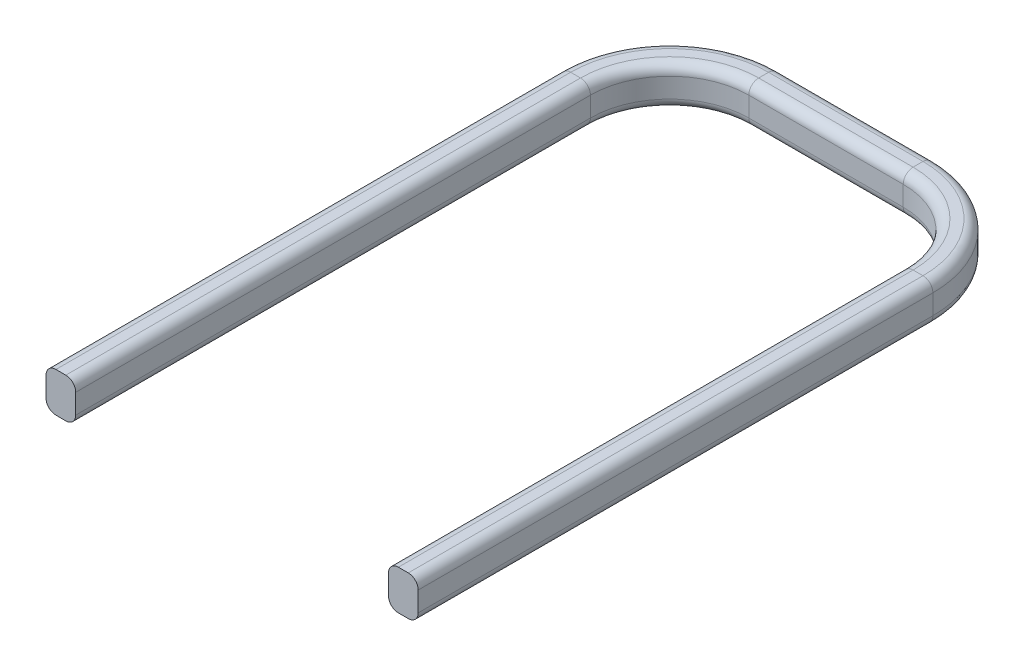
ISO-10303-21;
HEADER;
FILE_DESCRIPTION(('STEP AP214'),'2;1');
FILE_NAME('part.step','',(''),(''),'','','');
FILE_SCHEMA(('AUTOMOTIVE_DESIGN { 1 0 10303 214 1 1 1 1 }'));
ENDSEC;
DATA;
#1=APPLICATION_CONTEXT('core data for automotive mechanical design processes');
#2=APPLICATION_PROTOCOL_DEFINITION('international standard','automotive_design',2000,#1);
#3=PRODUCT_CONTEXT('',#1,'mechanical');
#4=PRODUCT('Part','Part','',(#3));
#5=PRODUCT_RELATED_PRODUCT_CATEGORY('part','',(#4));
#6=PRODUCT_DEFINITION_FORMATION('','',#4);
#7=PRODUCT_DEFINITION_CONTEXT('part definition',#1,'design');
#8=PRODUCT_DEFINITION('design','',#6,#7);
#9=PRODUCT_DEFINITION_SHAPE('','',#8);
#10=(LENGTH_UNIT() NAMED_UNIT(*) SI_UNIT(.MILLI.,.METRE.));
#11=(NAMED_UNIT(*) PLANE_ANGLE_UNIT() SI_UNIT($,.RADIAN.));
#12=(NAMED_UNIT(*) SI_UNIT($,.STERADIAN.) SOLID_ANGLE_UNIT());
#13=UNCERTAINTY_MEASURE_WITH_UNIT(LENGTH_MEASURE(1.E-05),#10,'distance_accuracy_value','');
#14=(GEOMETRIC_REPRESENTATION_CONTEXT(3) GLOBAL_UNCERTAINTY_ASSIGNED_CONTEXT((#13)) GLOBAL_UNIT_ASSIGNED_CONTEXT((#10,
#11,#12)) REPRESENTATION_CONTEXT('',''));
#15=CARTESIAN_POINT('',(0.,0.,0.));
#16=DIRECTION('',(0.,0.,1.));
#17=DIRECTION('',(1.,0.,0.));
#18=AXIS2_PLACEMENT_3D('',#15,#16,#17);
#19=CARTESIAN_POINT('',(7.9,0.,0.));
#20=DIRECTION('',(0.,0.,-1.));
#21=DIRECTION('',(-1.,0.,0.));
#22=AXIS2_PLACEMENT_3D('',#19,#20,#21);
#23=PLANE('',#22);
#24=DIRECTION('',(0.,1.,0.));
#25=VECTOR('',#24,1.);
#26=CARTESIAN_POINT('',(7.9,0.,0.));
#27=LINE('',#26,#25);
#28=CARTESIAN_POINT('',(7.9,0.25,0.));
#29=VERTEX_POINT('',#28);
#30=CARTESIAN_POINT('',(7.9,0.75,0.));
#31=VERTEX_POINT('',#30);
#32=EDGE_CURVE('E330',#29,#31,#27,.T.);
#33=ORIENTED_EDGE('',*,*,#32,.F.);
#34=CARTESIAN_POINT('',(8.15,0.25,0.));
#35=DIRECTION('',(0.,0.,-1.));
#36=DIRECTION('',(-1.,0.,0.));
#37=AXIS2_PLACEMENT_3D('',#34,#35,#36);
#38=CIRCLE('',#37,0.25);
#39=CARTESIAN_POINT('',(8.15,0.,0.));
#40=VERTEX_POINT('',#39);
#41=EDGE_CURVE('E220',#29,#40,#38,.F.);
#42=ORIENTED_EDGE('',*,*,#41,.T.);
#43=DIRECTION('',(-1.,0.,0.));
#44=VECTOR('',#43,1.);
#45=CARTESIAN_POINT('',(7.9,0.,0.));
#46=LINE('',#45,#44);
#47=CARTESIAN_POINT('',(8.4,0.,0.));
#48=VERTEX_POINT('',#47);
#49=EDGE_CURVE('E353',#48,#40,#46,.T.);
#50=ORIENTED_EDGE('',*,*,#49,.F.);
#51=CARTESIAN_POINT('',(8.4,0.25,0.));
#52=DIRECTION('',(0.,0.,-1.));
#53=DIRECTION('',(-1.,0.,0.));
#54=AXIS2_PLACEMENT_3D('',#51,#52,#53);
#55=CIRCLE('',#54,0.25);
#56=CARTESIAN_POINT('',(8.65,0.25,0.));
#57=VERTEX_POINT('',#56);
#58=EDGE_CURVE('E241',#48,#57,#55,.F.);
#59=ORIENTED_EDGE('',*,*,#58,.T.);
#60=DIRECTION('',(0.,-1.,0.));
#61=VECTOR('',#60,1.);
#62=CARTESIAN_POINT('',(8.65,0.,0.));
#63=LINE('',#62,#61);
#64=CARTESIAN_POINT('',(8.65,0.75,0.));
#65=VERTEX_POINT('',#64);
#66=EDGE_CURVE('E345',#65,#57,#63,.T.);
#67=ORIENTED_EDGE('',*,*,#66,.F.);
#68=CARTESIAN_POINT('',(8.4,0.75,0.));
#69=DIRECTION('',(0.,0.,-1.));
#70=DIRECTION('',(-1.,0.,0.));
#71=AXIS2_PLACEMENT_3D('',#68,#69,#70);
#72=CIRCLE('',#71,0.25);
#73=CARTESIAN_POINT('',(8.4,1.,0.));
#74=VERTEX_POINT('',#73);
#75=EDGE_CURVE('E429',#65,#74,#72,.F.);
#76=ORIENTED_EDGE('',*,*,#75,.T.);
#77=DIRECTION('',(1.,0.,0.));
#78=VECTOR('',#77,1.);
#79=CARTESIAN_POINT('',(7.9,1.,0.));
#80=LINE('',#79,#78);
#81=CARTESIAN_POINT('',(8.15,1.,0.));
#82=VERTEX_POINT('',#81);
#83=EDGE_CURVE('E337',#82,#74,#80,.T.);
#84=ORIENTED_EDGE('',*,*,#83,.F.);
#85=CARTESIAN_POINT('',(8.15,0.75,0.));
#86=DIRECTION('',(0.,0.,-1.));
#87=DIRECTION('',(-1.,0.,0.));
#88=AXIS2_PLACEMENT_3D('',#85,#86,#87);
#89=CIRCLE('',#88,0.25);
#90=EDGE_CURVE('E432',#82,#31,#89,.F.);
#91=ORIENTED_EDGE('',*,*,#90,.T.);
#92=EDGE_LOOP('',(#33,#42,#50,#59,#67,#76,#84,#91));
#93=FACE_BOUND('',#92,.T.);
#94=ADVANCED_FACE('F42',(#93),#23,.F.);
#95=CARTESIAN_POINT('',(0.,0.,0.));
#96=DIRECTION('',(0.,0.,1.));
#97=DIRECTION('',(1.,0.,0.));
#98=AXIS2_PLACEMENT_3D('',#95,#96,#97);
#99=PLANE('',#98);
#100=DIRECTION('',(1.,0.,0.));
#101=VECTOR('',#100,1.);
#102=CARTESIAN_POINT('',(0.,0.,0.));
#103=LINE('',#102,#101);
#104=CARTESIAN_POINT('',(-0.5,0.,0.));
#105=VERTEX_POINT('',#104);
#106=CARTESIAN_POINT('',(-0.25,0.,0.));
#107=VERTEX_POINT('',#106);
#108=EDGE_CURVE('E243',#105,#107,#103,.T.);
#109=ORIENTED_EDGE('',*,*,#108,.T.);
#110=CARTESIAN_POINT('',(-0.25,0.25,0.));
#111=DIRECTION('',(0.,0.,1.));
#112=DIRECTION('',(1.,0.,0.));
#113=AXIS2_PLACEMENT_3D('',#110,#111,#112);
#114=CIRCLE('',#113,0.25);
#115=CARTESIAN_POINT('',(0.,0.25,0.));
#116=VERTEX_POINT('',#115);
#117=EDGE_CURVE('E531',#107,#116,#114,.T.);
#118=ORIENTED_EDGE('',*,*,#117,.T.);
#119=DIRECTION('',(0.,1.,0.));
#120=VECTOR('',#119,1.);
#121=CARTESIAN_POINT('',(0.,0.,0.));
#122=LINE('',#121,#120);
#123=CARTESIAN_POINT('',(0.,0.75,0.));
#124=VERTEX_POINT('',#123);
#125=EDGE_CURVE('E369',#116,#124,#122,.T.);
#126=ORIENTED_EDGE('',*,*,#125,.T.);
#127=CARTESIAN_POINT('',(-0.25,0.75,0.));
#128=DIRECTION('',(0.,0.,1.));
#129=DIRECTION('',(1.,0.,0.));
#130=AXIS2_PLACEMENT_3D('',#127,#128,#129);
#131=CIRCLE('',#130,0.25);
#132=CARTESIAN_POINT('',(-0.25,1.,0.));
#133=VERTEX_POINT('',#132);
#134=EDGE_CURVE('E525',#124,#133,#131,.T.);
#135=ORIENTED_EDGE('',*,*,#134,.T.);
#136=DIRECTION('',(-1.,0.,0.));
#137=VECTOR('',#136,1.);
#138=CARTESIAN_POINT('',(0.,1.,0.));
#139=LINE('',#138,#137);
#140=CARTESIAN_POINT('',(-0.5,1.,0.));
#141=VERTEX_POINT('',#140);
#142=EDGE_CURVE('E372',#133,#141,#139,.T.);
#143=ORIENTED_EDGE('',*,*,#142,.T.);
#144=CARTESIAN_POINT('',(-0.5,0.75,0.));
#145=DIRECTION('',(0.,0.,1.));
#146=DIRECTION('',(1.,0.,0.));
#147=AXIS2_PLACEMENT_3D('',#144,#145,#146);
#148=CIRCLE('',#147,0.25);
#149=CARTESIAN_POINT('',(-0.75,0.75,0.));
#150=VERTEX_POINT('',#149);
#151=EDGE_CURVE('E67',#141,#150,#148,.T.);
#152=ORIENTED_EDGE('',*,*,#151,.T.);
#153=DIRECTION('',(0.,-1.,0.));
#154=VECTOR('',#153,1.);
#155=CARTESIAN_POINT('',(-0.75,0.,0.));
#156=LINE('',#155,#154);
#157=CARTESIAN_POINT('',(-0.75,0.25,0.));
#158=VERTEX_POINT('',#157);
#159=EDGE_CURVE('E391',#150,#158,#156,.T.);
#160=ORIENTED_EDGE('',*,*,#159,.T.);
#161=CARTESIAN_POINT('',(-0.5,0.25,0.));
#162=DIRECTION('',(0.,0.,1.));
#163=DIRECTION('',(1.,0.,0.));
#164=AXIS2_PLACEMENT_3D('',#161,#162,#163);
#165=CIRCLE('',#164,0.25);
#166=EDGE_CURVE('E528',#158,#105,#165,.T.);
#167=ORIENTED_EDGE('',*,*,#166,.T.);
#168=EDGE_LOOP('',(#109,#118,#126,#135,#143,#152,#160,#167));
#169=FACE_BOUND('',#168,.T.);
#170=ADVANCED_FACE('F623',(#169),#99,.T.);
#171=CARTESIAN_POINT('',(7.9,0.,0.));
#172=DIRECTION('',(-1.,0.,0.));
#173=DIRECTION('',(0.,0.,1.));
#174=AXIS2_PLACEMENT_3D('',#171,#172,#173);
#175=PLANE('',#174);
#176=DIRECTION('',(0.,1.,0.));
#177=VECTOR('',#176,1.);
#178=CARTESIAN_POINT('',(7.9,0.,-13.));
#179=LINE('',#178,#177);
#180=CARTESIAN_POINT('',(7.9,0.25,-13.));
#181=VERTEX_POINT('',#180);
#182=CARTESIAN_POINT('',(7.9,0.75,-13.));
#183=VERTEX_POINT('',#182);
#184=EDGE_CURVE('E348',#181,#183,#179,.T.);
#185=ORIENTED_EDGE('',*,*,#184,.F.);
#186=DIRECTION('',(0.,0.,-1.));
#187=VECTOR('',#186,1.);
#188=CARTESIAN_POINT('',(7.9,0.25,0.));
#189=LINE('',#188,#187);
#190=EDGE_CURVE('E426',#181,#29,#189,.F.);
#191=ORIENTED_EDGE('',*,*,#190,.T.);
#192=ORIENTED_EDGE('',*,*,#32,.T.);
#193=DIRECTION('',(0.,0.,-1.));
#194=VECTOR('',#193,1.);
#195=CARTESIAN_POINT('',(7.9,0.75,0.));
#196=LINE('',#195,#194);
#197=EDGE_CURVE('E423',#31,#183,#196,.T.);
#198=ORIENTED_EDGE('',*,*,#197,.T.);
#199=EDGE_LOOP('',(#185,#191,#192,#198));
#200=FACE_BOUND('',#199,.T.);
#201=ADVANCED_FACE('F579',(#200),#175,.T.);
#202=CARTESIAN_POINT('',(7.9,1.,0.));
#203=DIRECTION('',(0.,1.,0.));
#204=DIRECTION('',(0.,0.,1.));
#205=AXIS2_PLACEMENT_3D('',#202,#203,#204);
#206=PLANE('',#205);
#207=DIRECTION('',(1.,0.,0.));
#208=VECTOR('',#207,1.);
#209=CARTESIAN_POINT('',(7.9,1.,-13.));
#210=LINE('',#209,#208);
#211=CARTESIAN_POINT('',(8.15,1.,-13.));
#212=VERTEX_POINT('',#211);
#213=CARTESIAN_POINT('',(8.4,1.,-13.));
#214=VERTEX_POINT('',#213);
#215=EDGE_CURVE('E352',#212,#214,#210,.T.);
#216=ORIENTED_EDGE('',*,*,#215,.F.);
#217=DIRECTION('',(0.,0.,-1.));
#218=VECTOR('',#217,1.);
#219=CARTESIAN_POINT('',(8.15,1.,0.));
#220=LINE('',#219,#218);
#221=EDGE_CURVE('E497',#212,#82,#220,.F.);
#222=ORIENTED_EDGE('',*,*,#221,.T.);
#223=ORIENTED_EDGE('',*,*,#83,.T.);
#224=DIRECTION('',(0.,0.,-1.));
#225=VECTOR('',#224,1.);
#226=CARTESIAN_POINT('',(8.4,1.,0.));
#227=LINE('',#226,#225);
#228=EDGE_CURVE('E493',#74,#214,#227,.T.);
#229=ORIENTED_EDGE('',*,*,#228,.T.);
#230=EDGE_LOOP('',(#216,#222,#223,#229));
#231=FACE_BOUND('',#230,.T.);
#232=ADVANCED_FACE('F588',(#231),#206,.T.);
#233=CARTESIAN_POINT('',(8.65,0.,0.));
#234=DIRECTION('',(1.,0.,0.));
#235=DIRECTION('',(0.,1.,0.));
#236=AXIS2_PLACEMENT_3D('',#233,#234,#235);
#237=PLANE('',#236);
#238=ORIENTED_EDGE('',*,*,#66,.T.);
#239=DIRECTION('',(0.,0.,-1.));
#240=VECTOR('',#239,1.);
#241=CARTESIAN_POINT('',(8.65,0.25,0.));
#242=LINE('',#241,#240);
#243=CARTESIAN_POINT('',(8.65,0.25,-13.));
#244=VERTEX_POINT('',#243);
#245=EDGE_CURVE('E474',#57,#244,#242,.T.);
#246=ORIENTED_EDGE('',*,*,#245,.T.);
#247=DIRECTION('',(0.,-1.,0.));
#248=VECTOR('',#247,1.);
#249=CARTESIAN_POINT('',(8.65,0.,-13.));
#250=LINE('',#249,#248);
#251=CARTESIAN_POINT('',(8.65,0.75,-13.));
#252=VERTEX_POINT('',#251);
#253=EDGE_CURVE('E233',#252,#244,#250,.T.);
#254=ORIENTED_EDGE('',*,*,#253,.F.);
#255=DIRECTION('',(0.,0.,-1.));
#256=VECTOR('',#255,1.);
#257=CARTESIAN_POINT('',(8.65,0.75,0.));
#258=LINE('',#257,#256);
#259=EDGE_CURVE('E471',#252,#65,#258,.F.);
#260=ORIENTED_EDGE('',*,*,#259,.T.);
#261=EDGE_LOOP('',(#238,#246,#254,#260));
#262=FACE_BOUND('',#261,.T.);
#263=ADVANCED_FACE('F999',(#262),#237,.T.);
#264=CARTESIAN_POINT('',(7.9,0.,0.));
#265=DIRECTION('',(0.,-1.,0.));
#266=DIRECTION('',(1.,0.,0.));
#267=AXIS2_PLACEMENT_3D('',#264,#265,#266);
#268=PLANE('',#267);
#269=ORIENTED_EDGE('',*,*,#49,.T.);
#270=DIRECTION('',(0.,0.,-1.));
#271=VECTOR('',#270,1.);
#272=CARTESIAN_POINT('',(8.15,0.,0.));
#273=LINE('',#272,#271);
#274=CARTESIAN_POINT('',(8.15,0.,-13.));
#275=VERTEX_POINT('',#274);
#276=EDGE_CURVE('E230',#40,#275,#273,.T.);
#277=ORIENTED_EDGE('',*,*,#276,.T.);
#278=DIRECTION('',(-1.,0.,0.));
#279=VECTOR('',#278,1.);
#280=CARTESIAN_POINT('',(7.9,0.,-13.));
#281=LINE('',#280,#279);
#282=CARTESIAN_POINT('',(8.4,0.,-13.));
#283=VERTEX_POINT('',#282);
#284=EDGE_CURVE('E211',#283,#275,#281,.T.);
#285=ORIENTED_EDGE('',*,*,#284,.F.);
#286=DIRECTION('',(0.,0.,-1.));
#287=VECTOR('',#286,1.);
#288=CARTESIAN_POINT('',(8.4,0.,0.));
#289=LINE('',#288,#287);
#290=EDGE_CURVE('E227',#283,#48,#289,.F.);
#291=ORIENTED_EDGE('',*,*,#290,.T.);
#292=EDGE_LOOP('',(#269,#277,#285,#291));
#293=FACE_BOUND('',#292,.T.);
#294=ADVANCED_FACE('F226',(#293),#268,.T.);
#295=CARTESIAN_POINT('',(5.9,0.,-13.));
#296=DIRECTION('',(0.,1.,0.));
#297=DIRECTION('',(0.,0.,1.));
#298=AXIS2_PLACEMENT_3D('',#295,#296,#297);
#299=CYLINDRICAL_SURFACE('',#298,2.);
#300=DIRECTION('',(0.,1.,0.));
#301=VECTOR('',#300,1.);
#302=CARTESIAN_POINT('',(5.9,0.,-15.));
#303=LINE('',#302,#301);
#304=CARTESIAN_POINT('',(5.9,0.25,-15.));
#305=VERTEX_POINT('',#304);
#306=CARTESIAN_POINT('',(5.9,0.75,-15.));
#307=VERTEX_POINT('',#306);
#308=EDGE_CURVE('E232',#305,#307,#303,.T.);
#309=ORIENTED_EDGE('',*,*,#308,.F.);
#310=CARTESIAN_POINT('',(5.9,0.25,-13.));
#311=DIRECTION('',(0.,-1.,0.));
#312=DIRECTION('',(0.,0.,-1.));
#313=AXIS2_PLACEMENT_3D('',#310,#311,#312);
#314=CIRCLE('',#313,2.);
#315=EDGE_CURVE('E444',#305,#181,#314,.T.);
#316=ORIENTED_EDGE('',*,*,#315,.T.);
#317=ORIENTED_EDGE('',*,*,#184,.T.);
#318=CARTESIAN_POINT('',(5.9,0.75,-13.));
#319=DIRECTION('',(0.,1.,0.));
#320=DIRECTION('',(0.,0.,1.));
#321=AXIS2_PLACEMENT_3D('',#318,#319,#320);
#322=CIRCLE('',#321,2.);
#323=EDGE_CURVE('E441',#183,#307,#322,.T.);
#324=ORIENTED_EDGE('',*,*,#323,.T.);
#325=EDGE_LOOP('',(#309,#316,#317,#324));
#326=FACE_BOUND('',#325,.T.);
#327=ADVANCED_FACE('F571',(#326),#299,.F.);
#328=CARTESIAN_POINT('',(7.9,1.,-13.));
#329=DIRECTION('',(0.,1.,0.));
#330=DIRECTION('',(0.,0.,1.));
#331=AXIS2_PLACEMENT_3D('',#328,#329,#330);
#332=PLANE('',#331);
#333=DIRECTION('',(0.,0.,-1.));
#334=VECTOR('',#333,1.);
#335=CARTESIAN_POINT('',(5.9,1.,-15.));
#336=LINE('',#335,#334);
#337=CARTESIAN_POINT('',(5.9,1.,-15.25));
#338=VERTEX_POINT('',#337);
#339=CARTESIAN_POINT('',(5.9,1.,-15.5));
#340=VERTEX_POINT('',#339);
#341=EDGE_CURVE('E357',#338,#340,#336,.T.);
#342=ORIENTED_EDGE('',*,*,#341,.F.);
#343=CARTESIAN_POINT('',(5.9,1.,-13.));
#344=DIRECTION('',(0.,1.,0.));
#345=DIRECTION('',(0.,0.,1.));
#346=AXIS2_PLACEMENT_3D('',#343,#344,#345);
#347=CIRCLE('',#346,2.25);
#348=EDGE_CURVE('E503',#338,#212,#347,.F.);
#349=ORIENTED_EDGE('',*,*,#348,.T.);
#350=ORIENTED_EDGE('',*,*,#215,.T.);
#351=CARTESIAN_POINT('',(5.9,1.,-13.));
#352=DIRECTION('',(0.,1.,0.));
#353=DIRECTION('',(0.,0.,1.));
#354=AXIS2_PLACEMENT_3D('',#351,#352,#353);
#355=CIRCLE('',#354,2.5);
#356=EDGE_CURVE('E500',#214,#340,#355,.T.);
#357=ORIENTED_EDGE('',*,*,#356,.T.);
#358=EDGE_LOOP('',(#342,#349,#350,#357));
#359=FACE_BOUND('',#358,.T.);
#360=ADVANCED_FACE('F600',(#359),#332,.T.);
#361=CARTESIAN_POINT('',(5.9,0.,-13.));
#362=DIRECTION('',(0.,1.,0.));
#363=DIRECTION('',(0.,0.,1.));
#364=AXIS2_PLACEMENT_3D('',#361,#362,#363);
#365=CYLINDRICAL_SURFACE('',#364,2.75);
#366=ORIENTED_EDGE('',*,*,#253,.T.);
#367=CARTESIAN_POINT('',(5.9,0.25,-13.));
#368=DIRECTION('',(0.,-1.,0.));
#369=DIRECTION('',(0.,0.,-1.));
#370=AXIS2_PLACEMENT_3D('',#367,#368,#369);
#371=CIRCLE('',#370,2.75);
#372=CARTESIAN_POINT('',(5.9,0.25,-15.75));
#373=VERTEX_POINT('',#372);
#374=EDGE_CURVE('E246',#244,#373,#371,.F.);
#375=ORIENTED_EDGE('',*,*,#374,.T.);
#376=DIRECTION('',(0.,-1.,0.));
#377=VECTOR('',#376,1.);
#378=CARTESIAN_POINT('',(5.9,0.,-15.75));
#379=LINE('',#378,#377);
#380=CARTESIAN_POINT('',(5.9,0.75,-15.75));
#381=VERTEX_POINT('',#380);
#382=EDGE_CURVE('E381',#381,#373,#379,.T.);
#383=ORIENTED_EDGE('',*,*,#382,.F.);
#384=CARTESIAN_POINT('',(5.9,0.75,-13.));
#385=DIRECTION('',(0.,1.,0.));
#386=DIRECTION('',(0.,0.,1.));
#387=AXIS2_PLACEMENT_3D('',#384,#385,#386);
#388=CIRCLE('',#387,2.75);
#389=EDGE_CURVE('E477',#381,#252,#388,.F.);
#390=ORIENTED_EDGE('',*,*,#389,.T.);
#391=EDGE_LOOP('',(#366,#375,#383,#390));
#392=FACE_BOUND('',#391,.T.);
#393=ADVANCED_FACE('F961',(#392),#365,.T.);
#394=CARTESIAN_POINT('',(7.9,0.,-13.));
#395=DIRECTION('',(0.,-1.,0.));
#396=DIRECTION('',(0.,0.,-1.));
#397=AXIS2_PLACEMENT_3D('',#394,#395,#396);
#398=PLANE('',#397);
#399=ORIENTED_EDGE('',*,*,#284,.T.);
#400=CARTESIAN_POINT('',(5.9,0.,-13.));
#401=DIRECTION('',(0.,-1.,0.));
#402=DIRECTION('',(0.,0.,-1.));
#403=AXIS2_PLACEMENT_3D('',#400,#401,#402);
#404=CIRCLE('',#403,2.25);
#405=CARTESIAN_POINT('',(5.9,0.,-15.25));
#406=VERTEX_POINT('',#405);
#407=EDGE_CURVE('E219',#275,#406,#404,.F.);
#408=ORIENTED_EDGE('',*,*,#407,.T.);
#409=DIRECTION('',(0.,0.,1.));
#410=VECTOR('',#409,1.);
#411=CARTESIAN_POINT('',(5.9,0.,-15.));
#412=LINE('',#411,#410);
#413=CARTESIAN_POINT('',(5.9,0.,-15.5));
#414=VERTEX_POINT('',#413);
#415=EDGE_CURVE('E213',#414,#406,#412,.T.);
#416=ORIENTED_EDGE('',*,*,#415,.F.);
#417=CARTESIAN_POINT('',(5.9,0.,-13.));
#418=DIRECTION('',(0.,-1.,0.));
#419=DIRECTION('',(0.,0.,-1.));
#420=AXIS2_PLACEMENT_3D('',#417,#418,#419);
#421=CIRCLE('',#420,2.5);
#422=EDGE_CURVE('E208',#414,#283,#421,.T.);
#423=ORIENTED_EDGE('',*,*,#422,.T.);
#424=EDGE_LOOP('',(#399,#408,#416,#423));
#425=FACE_BOUND('',#424,.T.);
#426=ADVANCED_FACE('F210',(#425),#398,.T.);
#427=CARTESIAN_POINT('',(5.89999999999999,0.,-15.));
#428=DIRECTION('',(0.,0.,1.));
#429=DIRECTION('',(1.,0.,0.));
#430=AXIS2_PLACEMENT_3D('',#427,#428,#429);
#431=PLANE('',#430);
#432=DIRECTION('',(0.,1.,0.));
#433=VECTOR('',#432,1.);
#434=CARTESIAN_POINT('',(2.,0.,-15.));
#435=LINE('',#434,#433);
#436=CARTESIAN_POINT('',(2.,0.25,-15.));
#437=VERTEX_POINT('',#436);
#438=CARTESIAN_POINT('',(2.,0.75,-15.));
#439=VERTEX_POINT('',#438);
#440=EDGE_CURVE('E358',#437,#439,#435,.T.);
#441=ORIENTED_EDGE('',*,*,#440,.F.);
#442=DIRECTION('',(-1.,0.,0.));
#443=VECTOR('',#442,1.);
#444=CARTESIAN_POINT('',(5.89999999999999,0.25,-15.));
#445=LINE('',#444,#443);
#446=EDGE_CURVE('E456',#437,#305,#445,.F.);
#447=ORIENTED_EDGE('',*,*,#446,.T.);
#448=ORIENTED_EDGE('',*,*,#308,.T.);
#449=DIRECTION('',(-1.,0.,0.));
#450=VECTOR('',#449,1.);
#451=CARTESIAN_POINT('',(5.89999999999999,0.75,-15.));
#452=LINE('',#451,#450);
#453=EDGE_CURVE('E453',#307,#439,#452,.T.);
#454=ORIENTED_EDGE('',*,*,#453,.T.);
#455=EDGE_LOOP('',(#441,#447,#448,#454));
#456=FACE_BOUND('',#455,.T.);
#457=ADVANCED_FACE('F568',(#456),#431,.T.);
#458=CARTESIAN_POINT('',(5.89999999999999,1.,-15.));
#459=DIRECTION('',(0.,1.,0.));
#460=DIRECTION('',(0.,0.,1.));
#461=AXIS2_PLACEMENT_3D('',#458,#459,#460);
#462=PLANE('',#461);
#463=DIRECTION('',(0.,0.,-1.));
#464=VECTOR('',#463,1.);
#465=CARTESIAN_POINT('',(2.,1.,-15.));
#466=LINE('',#465,#464);
#467=CARTESIAN_POINT('',(2.,1.,-15.25));
#468=VERTEX_POINT('',#467);
#469=CARTESIAN_POINT('',(2.,1.,-15.5));
#470=VERTEX_POINT('',#469);
#471=EDGE_CURVE('E362',#468,#470,#466,.T.);
#472=ORIENTED_EDGE('',*,*,#471,.F.);
#473=DIRECTION('',(-1.,0.,0.));
#474=VECTOR('',#473,1.);
#475=CARTESIAN_POINT('',(5.89999999999999,1.,-15.25));
#476=LINE('',#475,#474);
#477=EDGE_CURVE('E509',#468,#338,#476,.F.);
#478=ORIENTED_EDGE('',*,*,#477,.T.);
#479=ORIENTED_EDGE('',*,*,#341,.T.);
#480=DIRECTION('',(-1.,0.,0.));
#481=VECTOR('',#480,1.);
#482=CARTESIAN_POINT('',(5.89999999999999,1.,-15.5));
#483=LINE('',#482,#481);
#484=EDGE_CURVE('E506',#340,#470,#483,.T.);
#485=ORIENTED_EDGE('',*,*,#484,.T.);
#486=EDGE_LOOP('',(#472,#478,#479,#485));
#487=FACE_BOUND('',#486,.T.);
#488=ADVANCED_FACE('F932',(#487),#462,.T.);
#489=CARTESIAN_POINT('',(5.89999999999999,0.,-15.75));
#490=DIRECTION('',(0.,0.,-1.));
#491=DIRECTION('',(0.,1.,0.));
#492=AXIS2_PLACEMENT_3D('',#489,#490,#491);
#493=PLANE('',#492);
#494=ORIENTED_EDGE('',*,*,#382,.T.);
#495=DIRECTION('',(-1.,0.,0.));
#496=VECTOR('',#495,1.);
#497=CARTESIAN_POINT('',(5.89999999999999,0.25,-15.75));
#498=LINE('',#497,#496);
#499=CARTESIAN_POINT('',(2.,0.25,-15.75));
#500=VERTEX_POINT('',#499);
#501=EDGE_CURVE('E485',#373,#500,#498,.T.);
#502=ORIENTED_EDGE('',*,*,#501,.T.);
#503=DIRECTION('',(0.,-1.,0.));
#504=VECTOR('',#503,1.);
#505=CARTESIAN_POINT('',(2.,0.,-15.75));
#506=LINE('',#505,#504);
#507=CARTESIAN_POINT('',(2.,0.75,-15.75));
#508=VERTEX_POINT('',#507);
#509=EDGE_CURVE('E385',#508,#500,#506,.T.);
#510=ORIENTED_EDGE('',*,*,#509,.F.);
#511=DIRECTION('',(-1.,0.,0.));
#512=VECTOR('',#511,1.);
#513=CARTESIAN_POINT('',(5.89999999999999,0.75,-15.75));
#514=LINE('',#513,#512);
#515=EDGE_CURVE('E482',#508,#381,#514,.F.);
#516=ORIENTED_EDGE('',*,*,#515,.T.);
#517=EDGE_LOOP('',(#494,#502,#510,#516));
#518=FACE_BOUND('',#517,.T.);
#519=ADVANCED_FACE('F923',(#518),#493,.T.);
#520=CARTESIAN_POINT('',(5.89999999999999,0.,-15.));
#521=DIRECTION('',(0.,-1.,0.));
#522=DIRECTION('',(0.,0.,-1.));
#523=AXIS2_PLACEMENT_3D('',#520,#521,#522);
#524=PLANE('',#523);
#525=ORIENTED_EDGE('',*,*,#415,.T.);
#526=DIRECTION('',(-1.,0.,0.));
#527=VECTOR('',#526,1.);
#528=CARTESIAN_POINT('',(5.89999999999999,0.,-15.25));
#529=LINE('',#528,#527);
#530=CARTESIAN_POINT('',(2.,0.,-15.25));
#531=VERTEX_POINT('',#530);
#532=EDGE_CURVE('E450',#406,#531,#529,.T.);
#533=ORIENTED_EDGE('',*,*,#532,.T.);
#534=DIRECTION('',(0.,0.,1.));
#535=VECTOR('',#534,1.);
#536=CARTESIAN_POINT('',(2.,0.,-15.));
#537=LINE('',#536,#535);
#538=CARTESIAN_POINT('',(2.,0.,-15.5));
#539=VERTEX_POINT('',#538);
#540=EDGE_CURVE('E368',#539,#531,#537,.T.);
#541=ORIENTED_EDGE('',*,*,#540,.F.);
#542=DIRECTION('',(-1.,0.,0.));
#543=VECTOR('',#542,1.);
#544=CARTESIAN_POINT('',(5.89999999999999,0.,-15.5));
#545=LINE('',#544,#543);
#546=EDGE_CURVE('E447',#539,#414,#545,.F.);
#547=ORIENTED_EDGE('',*,*,#546,.T.);
#548=EDGE_LOOP('',(#525,#533,#541,#547));
#549=FACE_BOUND('',#548,.T.);
#550=ADVANCED_FACE('F557',(#549),#524,.T.);
#551=CARTESIAN_POINT('',(2.,0.,-13.));
#552=DIRECTION('',(0.,1.,0.));
#553=DIRECTION('',(0.,0.,1.));
#554=AXIS2_PLACEMENT_3D('',#551,#552,#553);
#555=CYLINDRICAL_SURFACE('',#554,2.);
#556=DIRECTION('',(0.,1.,0.));
#557=VECTOR('',#556,1.);
#558=CARTESIAN_POINT('',(0.,0.,-13.));
#559=LINE('',#558,#557);
#560=CARTESIAN_POINT('',(0.,0.25,-13.));
#561=VERTEX_POINT('',#560);
#562=CARTESIAN_POINT('',(0.,0.75,-13.));
#563=VERTEX_POINT('',#562);
#564=EDGE_CURVE('E363',#561,#563,#559,.T.);
#565=ORIENTED_EDGE('',*,*,#564,.F.);
#566=CARTESIAN_POINT('',(2.,0.25,-13.));
#567=DIRECTION('',(0.,-1.,0.));
#568=DIRECTION('',(0.,0.,-1.));
#569=AXIS2_PLACEMENT_3D('',#566,#567,#568);
#570=CIRCLE('',#569,2.);
#571=EDGE_CURVE('E468',#561,#437,#570,.T.);
#572=ORIENTED_EDGE('',*,*,#571,.T.);
#573=ORIENTED_EDGE('',*,*,#440,.T.);
#574=CARTESIAN_POINT('',(2.,0.75,-13.));
#575=DIRECTION('',(0.,1.,0.));
#576=DIRECTION('',(0.,0.,1.));
#577=AXIS2_PLACEMENT_3D('',#574,#575,#576);
#578=CIRCLE('',#577,2.);
#579=EDGE_CURVE('E465',#439,#563,#578,.T.);
#580=ORIENTED_EDGE('',*,*,#579,.T.);
#581=EDGE_LOOP('',(#565,#572,#573,#580));
#582=FACE_BOUND('',#581,.T.);
#583=ADVANCED_FACE('F609',(#582),#555,.F.);
#584=CARTESIAN_POINT('',(2.,1.,-15.));
#585=DIRECTION('',(0.,1.,0.));
#586=DIRECTION('',(0.,0.,1.));
#587=AXIS2_PLACEMENT_3D('',#584,#585,#586);
#588=PLANE('',#587);
#589=DIRECTION('',(-1.,0.,0.));
#590=VECTOR('',#589,1.);
#591=CARTESIAN_POINT('',(0.,1.,-13.));
#592=LINE('',#591,#590);
#593=CARTESIAN_POINT('',(-0.25,1.,-13.));
#594=VERTEX_POINT('',#593);
#595=CARTESIAN_POINT('',(-0.5,1.,-13.));
#596=VERTEX_POINT('',#595);
#597=EDGE_CURVE('E367',#594,#596,#592,.T.);
#598=ORIENTED_EDGE('',*,*,#597,.F.);
#599=CARTESIAN_POINT('',(2.,1.,-13.));
#600=DIRECTION('',(0.,1.,0.));
#601=DIRECTION('',(0.,0.,1.));
#602=AXIS2_PLACEMENT_3D('',#599,#600,#601);
#603=CIRCLE('',#602,2.25);
#604=EDGE_CURVE('E514',#594,#468,#603,.F.);
#605=ORIENTED_EDGE('',*,*,#604,.T.);
#606=ORIENTED_EDGE('',*,*,#471,.T.);
#607=CARTESIAN_POINT('',(2.,1.,-13.));
#608=DIRECTION('',(0.,1.,0.));
#609=DIRECTION('',(0.,0.,1.));
#610=AXIS2_PLACEMENT_3D('',#607,#608,#609);
#611=CIRCLE('',#610,2.5);
#612=EDGE_CURVE('E301',#470,#596,#611,.T.);
#613=ORIENTED_EDGE('',*,*,#612,.T.);
#614=EDGE_LOOP('',(#598,#605,#606,#613));
#615=FACE_BOUND('',#614,.T.);
#616=ADVANCED_FACE('F894',(#615),#588,.T.);
#617=CARTESIAN_POINT('',(2.,0.,-13.));
#618=DIRECTION('',(0.,1.,0.));
#619=DIRECTION('',(0.,0.,1.));
#620=AXIS2_PLACEMENT_3D('',#617,#618,#619);
#621=CYLINDRICAL_SURFACE('',#620,2.75);
#622=ORIENTED_EDGE('',*,*,#509,.T.);
#623=CARTESIAN_POINT('',(2.,0.25,-13.));
#624=DIRECTION('',(0.,-1.,0.));
#625=DIRECTION('',(0.,0.,-1.));
#626=AXIS2_PLACEMENT_3D('',#623,#624,#625);
#627=CIRCLE('',#626,2.75);
#628=CARTESIAN_POINT('',(-0.75,0.25,-13.));
#629=VERTEX_POINT('',#628);
#630=EDGE_CURVE('E490',#500,#629,#627,.F.);
#631=ORIENTED_EDGE('',*,*,#630,.T.);
#632=DIRECTION('',(0.,-1.,0.));
#633=VECTOR('',#632,1.);
#634=CARTESIAN_POINT('',(-0.75,0.,-13.));
#635=LINE('',#634,#633);
#636=CARTESIAN_POINT('',(-0.75,0.75,-13.));
#637=VERTEX_POINT('',#636);
#638=EDGE_CURVE('E388',#637,#629,#635,.T.);
#639=ORIENTED_EDGE('',*,*,#638,.F.);
#640=CARTESIAN_POINT('',(2.,0.75,-13.));
#641=DIRECTION('',(0.,1.,0.));
#642=DIRECTION('',(0.,0.,1.));
#643=AXIS2_PLACEMENT_3D('',#640,#641,#642);
#644=CIRCLE('',#643,2.75);
#645=EDGE_CURVE('E302',#637,#508,#644,.F.);
#646=ORIENTED_EDGE('',*,*,#645,.T.);
#647=EDGE_LOOP('',(#622,#631,#639,#646));
#648=FACE_BOUND('',#647,.T.);
#649=ADVANCED_FACE('F543',(#648),#621,.T.);
#650=CARTESIAN_POINT('',(2.,0.,-15.));
#651=DIRECTION('',(0.,-1.,0.));
#652=DIRECTION('',(0.,0.,-1.));
#653=AXIS2_PLACEMENT_3D('',#650,#651,#652);
#654=PLANE('',#653);
#655=ORIENTED_EDGE('',*,*,#540,.T.);
#656=CARTESIAN_POINT('',(2.,0.,-13.));
#657=DIRECTION('',(0.,-1.,0.));
#658=DIRECTION('',(0.,0.,-1.));
#659=AXIS2_PLACEMENT_3D('',#656,#657,#658);
#660=CIRCLE('',#659,2.25);
#661=CARTESIAN_POINT('',(-0.25,0.,-13.));
#662=VERTEX_POINT('',#661);
#663=EDGE_CURVE('E462',#531,#662,#660,.F.);
#664=ORIENTED_EDGE('',*,*,#663,.T.);
#665=DIRECTION('',(1.,0.,0.));
#666=VECTOR('',#665,1.);
#667=CARTESIAN_POINT('',(0.,0.,-13.));
#668=LINE('',#667,#666);
#669=CARTESIAN_POINT('',(-0.5,0.,-13.));
#670=VERTEX_POINT('',#669);
#671=EDGE_CURVE('E373',#670,#662,#668,.T.);
#672=ORIENTED_EDGE('',*,*,#671,.F.);
#673=CARTESIAN_POINT('',(2.,0.,-13.));
#674=DIRECTION('',(0.,-1.,0.));
#675=DIRECTION('',(0.,0.,-1.));
#676=AXIS2_PLACEMENT_3D('',#673,#674,#675);
#677=CIRCLE('',#676,2.5);
#678=EDGE_CURVE('E459',#670,#539,#677,.T.);
#679=ORIENTED_EDGE('',*,*,#678,.T.);
#680=EDGE_LOOP('',(#655,#664,#672,#679));
#681=FACE_BOUND('',#680,.T.);
#682=ADVANCED_FACE('F559',(#681),#654,.T.);
#683=CARTESIAN_POINT('',(0.,0.,-13.));
#684=DIRECTION('',(1.,0.,0.));
#685=DIRECTION('',(0.,0.,-1.));
#686=AXIS2_PLACEMENT_3D('',#683,#684,#685);
#687=PLANE('',#686);
#688=ORIENTED_EDGE('',*,*,#125,.F.);
#689=DIRECTION('',(0.,0.,1.));
#690=VECTOR('',#689,1.);
#691=CARTESIAN_POINT('',(0.,0.25,-13.));
#692=LINE('',#691,#690);
#693=EDGE_CURVE('E537',#116,#561,#692,.F.);
#694=ORIENTED_EDGE('',*,*,#693,.T.);
#695=ORIENTED_EDGE('',*,*,#564,.T.);
#696=DIRECTION('',(0.,0.,1.));
#697=VECTOR('',#696,1.);
#698=CARTESIAN_POINT('',(0.,0.75,-13.));
#699=LINE('',#698,#697);
#700=EDGE_CURVE('E534',#563,#124,#699,.T.);
#701=ORIENTED_EDGE('',*,*,#700,.T.);
#702=EDGE_LOOP('',(#688,#694,#695,#701));
#703=FACE_BOUND('',#702,.T.);
#704=ADVANCED_FACE('F621',(#703),#687,.T.);
#705=CARTESIAN_POINT('',(0.,1.,-13.));
#706=DIRECTION('',(0.,1.,0.));
#707=DIRECTION('',(0.,0.,1.));
#708=AXIS2_PLACEMENT_3D('',#705,#706,#707);
#709=PLANE('',#708);
#710=ORIENTED_EDGE('',*,*,#142,.F.);
#711=DIRECTION('',(0.,0.,1.));
#712=VECTOR('',#711,1.);
#713=CARTESIAN_POINT('',(-0.25,1.,-13.));
#714=LINE('',#713,#712);
#715=EDGE_CURVE('E11',#133,#594,#714,.F.);
#716=ORIENTED_EDGE('',*,*,#715,.T.);
#717=ORIENTED_EDGE('',*,*,#597,.T.);
#718=DIRECTION('',(0.,0.,1.));
#719=VECTOR('',#718,1.);
#720=CARTESIAN_POINT('',(-0.5,1.,-13.));
#721=LINE('',#720,#719);
#722=EDGE_CURVE('E52',#596,#141,#721,.T.);
#723=ORIENTED_EDGE('',*,*,#722,.T.);
#724=EDGE_LOOP('',(#710,#716,#717,#723));
#725=FACE_BOUND('',#724,.T.);
#726=ADVANCED_FACE('F654',(#725),#709,.T.);
#727=CARTESIAN_POINT('',(-0.75,0.,-13.));
#728=DIRECTION('',(-1.,0.,0.));
#729=DIRECTION('',(0.,-1.,0.));
#730=AXIS2_PLACEMENT_3D('',#727,#728,#729);
#731=PLANE('',#730);
#732=ORIENTED_EDGE('',*,*,#638,.T.);
#733=DIRECTION('',(0.,0.,1.));
#734=VECTOR('',#733,1.);
#735=CARTESIAN_POINT('',(-0.75,0.25,-13.));
#736=LINE('',#735,#734);
#737=EDGE_CURVE('E60',#629,#158,#736,.T.);
#738=ORIENTED_EDGE('',*,*,#737,.T.);
#739=ORIENTED_EDGE('',*,*,#159,.F.);
#740=DIRECTION('',(0.,0.,1.));
#741=VECTOR('',#740,1.);
#742=CARTESIAN_POINT('',(-0.75,0.75,-13.));
#743=LINE('',#742,#741);
#744=EDGE_CURVE('E306',#150,#637,#743,.F.);
#745=ORIENTED_EDGE('',*,*,#744,.T.);
#746=EDGE_LOOP('',(#732,#738,#739,#745));
#747=FACE_BOUND('',#746,.T.);
#748=ADVANCED_FACE('F541',(#747),#731,.T.);
#749=CARTESIAN_POINT('',(0.,0.,-13.));
#750=DIRECTION('',(0.,-1.,0.));
#751=DIRECTION('',(1.,0.,0.));
#752=AXIS2_PLACEMENT_3D('',#749,#750,#751);
#753=PLANE('',#752);
#754=ORIENTED_EDGE('',*,*,#671,.T.);
#755=DIRECTION('',(0.,0.,1.));
#756=VECTOR('',#755,1.);
#757=CARTESIAN_POINT('',(-0.25,0.,-13.));
#758=LINE('',#757,#756);
#759=EDGE_CURVE('E520',#662,#107,#758,.T.);
#760=ORIENTED_EDGE('',*,*,#759,.T.);
#761=ORIENTED_EDGE('',*,*,#108,.F.);
#762=DIRECTION('',(0.,0.,1.));
#763=VECTOR('',#762,1.);
#764=CARTESIAN_POINT('',(-0.5,0.,-13.));
#765=LINE('',#764,#763);
#766=EDGE_CURVE('E517',#105,#670,#765,.F.);
#767=ORIENTED_EDGE('',*,*,#766,.T.);
#768=EDGE_LOOP('',(#754,#760,#761,#767));
#769=FACE_BOUND('',#768,.T.);
#770=ADVANCED_FACE('F630',(#769),#753,.T.);
#771=CARTESIAN_POINT('',(-0.25,0.25,-13.));
#772=DIRECTION('',(0.,0.,1.));
#773=DIRECTION('',(1.,0.,0.));
#774=AXIS2_PLACEMENT_3D('',#771,#772,#773);
#775=CYLINDRICAL_SURFACE('',#774,0.25);
#776=ORIENTED_EDGE('',*,*,#117,.F.);
#777=ORIENTED_EDGE('',*,*,#759,.F.);
#778=CARTESIAN_POINT('',(-0.25,0.25,-13.));
#779=DIRECTION('',(0.,0.,-1.));
#780=DIRECTION('',(-1.,0.,0.));
#781=AXIS2_PLACEMENT_3D('',#778,#779,#780);
#782=CIRCLE('',#781,0.25);
#783=EDGE_CURVE('E260',#561,#662,#782,.T.);
#784=ORIENTED_EDGE('',*,*,#783,.F.);
#785=ORIENTED_EDGE('',*,*,#693,.F.);
#786=EDGE_LOOP('',(#776,#777,#784,#785));
#787=FACE_BOUND('',#786,.T.);
#788=ADVANCED_FACE('F628',(#787),#775,.T.);
#789=CARTESIAN_POINT('',(2.,0.25,-13.));
#790=DIRECTION('',(0.,-1.,0.));
#791=DIRECTION('',(0.,0.,-1.));
#792=AXIS2_PLACEMENT_3D('',#789,#790,#791);
#793=TOROIDAL_SURFACE('',#792,2.25,0.25);
#794=ORIENTED_EDGE('',*,*,#783,.T.);
#795=ORIENTED_EDGE('',*,*,#663,.F.);
#796=CARTESIAN_POINT('',(2.,0.25,-15.25));
#797=DIRECTION('',(1.,0.,0.));
#798=DIRECTION('',(0.,0.,-1.));
#799=AXIS2_PLACEMENT_3D('',#796,#797,#798);
#800=CIRCLE('',#799,0.25);
#801=EDGE_CURVE('E321',#437,#531,#800,.T.);
#802=ORIENTED_EDGE('',*,*,#801,.F.);
#803=ORIENTED_EDGE('',*,*,#571,.F.);
#804=EDGE_LOOP('',(#794,#795,#802,#803));
#805=FACE_BOUND('',#804,.T.);
#806=ADVANCED_FACE('F561',(#805),#793,.T.);
#807=CARTESIAN_POINT('',(5.89999999999999,0.25,-15.25));
#808=DIRECTION('',(-1.,0.,0.));
#809=DIRECTION('',(0.,0.,1.));
#810=AXIS2_PLACEMENT_3D('',#807,#808,#809);
#811=CYLINDRICAL_SURFACE('',#810,0.25);
#812=ORIENTED_EDGE('',*,*,#801,.T.);
#813=ORIENTED_EDGE('',*,*,#532,.F.);
#814=CARTESIAN_POINT('',(5.9,0.25,-15.25));
#815=DIRECTION('',(1.,0.,0.));
#816=DIRECTION('',(0.,0.,-1.));
#817=AXIS2_PLACEMENT_3D('',#814,#815,#816);
#818=CIRCLE('',#817,0.25);
#819=EDGE_CURVE('E318',#305,#406,#818,.T.);
#820=ORIENTED_EDGE('',*,*,#819,.F.);
#821=ORIENTED_EDGE('',*,*,#446,.F.);
#822=EDGE_LOOP('',(#812,#813,#820,#821));
#823=FACE_BOUND('',#822,.T.);
#824=ADVANCED_FACE('F563',(#823),#811,.T.);
#825=CARTESIAN_POINT('',(5.9,0.25,-13.));
#826=DIRECTION('',(0.,-1.,0.));
#827=DIRECTION('',(0.,0.,-1.));
#828=AXIS2_PLACEMENT_3D('',#825,#826,#827);
#829=TOROIDAL_SURFACE('',#828,2.25,0.25);
#830=ORIENTED_EDGE('',*,*,#819,.T.);
#831=ORIENTED_EDGE('',*,*,#407,.F.);
#832=CARTESIAN_POINT('',(8.15,0.25,-13.));
#833=DIRECTION('',(0.,0.,1.));
#834=DIRECTION('',(0.,-1.,0.));
#835=AXIS2_PLACEMENT_3D('',#832,#833,#834);
#836=CIRCLE('',#835,0.25);
#837=EDGE_CURVE('E270',#181,#275,#836,.T.);
#838=ORIENTED_EDGE('',*,*,#837,.F.);
#839=ORIENTED_EDGE('',*,*,#315,.F.);
#840=EDGE_LOOP('',(#830,#831,#838,#839));
#841=FACE_BOUND('',#840,.T.);
#842=ADVANCED_FACE('F643',(#841),#829,.T.);
#843=CARTESIAN_POINT('',(8.15,0.25,0.));
#844=DIRECTION('',(0.,0.,-1.));
#845=DIRECTION('',(-1.,0.,0.));
#846=AXIS2_PLACEMENT_3D('',#843,#844,#845);
#847=CYLINDRICAL_SURFACE('',#846,0.25);
#848=ORIENTED_EDGE('',*,*,#41,.F.);
#849=ORIENTED_EDGE('',*,*,#190,.F.);
#850=ORIENTED_EDGE('',*,*,#837,.T.);
#851=ORIENTED_EDGE('',*,*,#276,.F.);
#852=EDGE_LOOP('',(#848,#849,#850,#851));
#853=FACE_BOUND('',#852,.T.);
#854=ADVANCED_FACE('F636',(#853),#847,.T.);
#855=CARTESIAN_POINT('',(-0.5,0.25,-13.));
#856=DIRECTION('',(0.,0.,1.));
#857=DIRECTION('',(1.,0.,0.));
#858=AXIS2_PLACEMENT_3D('',#855,#856,#857);
#859=CYLINDRICAL_SURFACE('',#858,0.25);
#860=ORIENTED_EDGE('',*,*,#166,.F.);
#861=ORIENTED_EDGE('',*,*,#737,.F.);
#862=CARTESIAN_POINT('',(-0.5,0.25,-13.));
#863=DIRECTION('',(0.,0.,-1.));
#864=DIRECTION('',(-1.,0.,0.));
#865=AXIS2_PLACEMENT_3D('',#862,#863,#864);
#866=CIRCLE('',#865,0.25);
#867=EDGE_CURVE('E266',#670,#629,#866,.T.);
#868=ORIENTED_EDGE('',*,*,#867,.F.);
#869=ORIENTED_EDGE('',*,*,#766,.F.);
#870=EDGE_LOOP('',(#860,#861,#868,#869));
#871=FACE_BOUND('',#870,.T.);
#872=ADVANCED_FACE('F634',(#871),#859,.T.);
#873=CARTESIAN_POINT('',(2.,0.25,-13.));
#874=DIRECTION('',(0.,-1.,0.));
#875=DIRECTION('',(0.,0.,-1.));
#876=AXIS2_PLACEMENT_3D('',#873,#874,#875);
#877=TOROIDAL_SURFACE('',#876,2.5,0.25);
#878=ORIENTED_EDGE('',*,*,#867,.T.);
#879=ORIENTED_EDGE('',*,*,#630,.F.);
#880=CARTESIAN_POINT('',(2.,0.25,-15.5));
#881=DIRECTION('',(1.,0.,0.));
#882=DIRECTION('',(0.,0.,-1.));
#883=AXIS2_PLACEMENT_3D('',#880,#881,#882);
#884=CIRCLE('',#883,0.25);
#885=EDGE_CURVE('E254',#539,#500,#884,.T.);
#886=ORIENTED_EDGE('',*,*,#885,.F.);
#887=ORIENTED_EDGE('',*,*,#678,.F.);
#888=EDGE_LOOP('',(#878,#879,#886,#887));
#889=FACE_BOUND('',#888,.T.);
#890=ADVANCED_FACE('F548',(#889),#877,.T.);
#891=CARTESIAN_POINT('',(5.89999999999999,0.25,-15.5));
#892=DIRECTION('',(-1.,0.,0.));
#893=DIRECTION('',(0.,0.,1.));
#894=AXIS2_PLACEMENT_3D('',#891,#892,#893);
#895=CYLINDRICAL_SURFACE('',#894,0.25);
#896=ORIENTED_EDGE('',*,*,#885,.T.);
#897=ORIENTED_EDGE('',*,*,#501,.F.);
#898=CARTESIAN_POINT('',(5.9,0.25,-15.5));
#899=DIRECTION('',(1.,0.,0.));
#900=DIRECTION('',(0.,0.,-1.));
#901=AXIS2_PLACEMENT_3D('',#898,#899,#900);
#902=CIRCLE('',#901,0.25);
#903=EDGE_CURVE('E249',#414,#373,#902,.T.);
#904=ORIENTED_EDGE('',*,*,#903,.F.);
#905=ORIENTED_EDGE('',*,*,#546,.F.);
#906=EDGE_LOOP('',(#896,#897,#904,#905));
#907=FACE_BOUND('',#906,.T.);
#908=ADVANCED_FACE('F554',(#907),#895,.T.);
#909=CARTESIAN_POINT('',(5.9,0.25,-13.));
#910=DIRECTION('',(0.,-1.,0.));
#911=DIRECTION('',(0.,0.,-1.));
#912=AXIS2_PLACEMENT_3D('',#909,#910,#911);
#913=TOROIDAL_SURFACE('',#912,2.5,0.25);
#914=ORIENTED_EDGE('',*,*,#903,.T.);
#915=ORIENTED_EDGE('',*,*,#374,.F.);
#916=CARTESIAN_POINT('',(8.4,0.25,-13.));
#917=DIRECTION('',(0.,0.,1.));
#918=DIRECTION('',(1.,0.,0.));
#919=AXIS2_PLACEMENT_3D('',#916,#917,#918);
#920=CIRCLE('',#919,0.25);
#921=EDGE_CURVE('E239',#283,#244,#920,.T.);
#922=ORIENTED_EDGE('',*,*,#921,.F.);
#923=ORIENTED_EDGE('',*,*,#422,.F.);
#924=EDGE_LOOP('',(#914,#915,#922,#923));
#925=FACE_BOUND('',#924,.T.);
#926=ADVANCED_FACE('F245',(#925),#913,.T.);
#927=CARTESIAN_POINT('',(8.4,0.25,0.));
#928=DIRECTION('',(0.,0.,-1.));
#929=DIRECTION('',(-1.,0.,0.));
#930=AXIS2_PLACEMENT_3D('',#927,#928,#929);
#931=CYLINDRICAL_SURFACE('',#930,0.25);
#932=ORIENTED_EDGE('',*,*,#58,.F.);
#933=ORIENTED_EDGE('',*,*,#290,.F.);
#934=ORIENTED_EDGE('',*,*,#921,.T.);
#935=ORIENTED_EDGE('',*,*,#245,.F.);
#936=EDGE_LOOP('',(#932,#933,#934,#935));
#937=FACE_BOUND('',#936,.T.);
#938=ADVANCED_FACE('F237',(#937),#931,.T.);
#939=CARTESIAN_POINT('',(-0.25,0.75,-13.));
#940=DIRECTION('',(0.,0.,1.));
#941=DIRECTION('',(1.,0.,0.));
#942=AXIS2_PLACEMENT_3D('',#939,#940,#941);
#943=CYLINDRICAL_SURFACE('',#942,0.25);
#944=ORIENTED_EDGE('',*,*,#134,.F.);
#945=ORIENTED_EDGE('',*,*,#700,.F.);
#946=CARTESIAN_POINT('',(-0.25,0.75,-13.));
#947=DIRECTION('',(0.,0.,-1.));
#948=DIRECTION('',(-1.,0.,0.));
#949=AXIS2_PLACEMENT_3D('',#946,#947,#948);
#950=CIRCLE('',#949,0.25);
#951=EDGE_CURVE('E250',#594,#563,#950,.T.);
#952=ORIENTED_EDGE('',*,*,#951,.F.);
#953=ORIENTED_EDGE('',*,*,#715,.F.);
#954=EDGE_LOOP('',(#944,#945,#952,#953));
#955=FACE_BOUND('',#954,.T.);
#956=ADVANCED_FACE('F618',(#955),#943,.T.);
#957=CARTESIAN_POINT('',(2.,0.75,-13.));
#958=DIRECTION('',(0.,1.,0.));
#959=DIRECTION('',(0.,0.,1.));
#960=AXIS2_PLACEMENT_3D('',#957,#958,#959);
#961=TOROIDAL_SURFACE('',#960,2.25,0.25);
#962=ORIENTED_EDGE('',*,*,#951,.T.);
#963=ORIENTED_EDGE('',*,*,#579,.F.);
#964=CARTESIAN_POINT('',(2.,0.75,-15.25));
#965=DIRECTION('',(1.,0.,0.));
#966=DIRECTION('',(0.,0.,-1.));
#967=AXIS2_PLACEMENT_3D('',#964,#965,#966);
#968=CIRCLE('',#967,0.25);
#969=EDGE_CURVE('E257',#468,#439,#968,.T.);
#970=ORIENTED_EDGE('',*,*,#969,.F.);
#971=ORIENTED_EDGE('',*,*,#604,.F.);
#972=EDGE_LOOP('',(#962,#963,#970,#971));
#973=FACE_BOUND('',#972,.T.);
#974=ADVANCED_FACE('F611',(#973),#961,.T.);
#975=CARTESIAN_POINT('',(5.89999999999999,0.75,-15.25));
#976=DIRECTION('',(-1.,0.,0.));
#977=DIRECTION('',(0.,0.,1.));
#978=AXIS2_PLACEMENT_3D('',#975,#976,#977);
#979=CYLINDRICAL_SURFACE('',#978,0.25);
#980=ORIENTED_EDGE('',*,*,#969,.T.);
#981=ORIENTED_EDGE('',*,*,#453,.F.);
#982=CARTESIAN_POINT('',(5.9,0.75,-15.25));
#983=DIRECTION('',(1.,0.,0.));
#984=DIRECTION('',(0.,0.,-1.));
#985=AXIS2_PLACEMENT_3D('',#982,#983,#984);
#986=CIRCLE('',#985,0.25);
#987=EDGE_CURVE('E274',#338,#307,#986,.T.);
#988=ORIENTED_EDGE('',*,*,#987,.F.);
#989=ORIENTED_EDGE('',*,*,#477,.F.);
#990=EDGE_LOOP('',(#980,#981,#988,#989));
#991=FACE_BOUND('',#990,.T.);
#992=ADVANCED_FACE('F604',(#991),#979,.T.);
#993=CARTESIAN_POINT('',(5.9,0.75,-13.));
#994=DIRECTION('',(0.,1.,0.));
#995=DIRECTION('',(0.,0.,1.));
#996=AXIS2_PLACEMENT_3D('',#993,#994,#995);
#997=TOROIDAL_SURFACE('',#996,2.25,0.25);
#998=ORIENTED_EDGE('',*,*,#987,.T.);
#999=ORIENTED_EDGE('',*,*,#323,.F.);
#1000=CARTESIAN_POINT('',(8.15,0.75,-13.));
#1001=DIRECTION('',(0.,0.,1.));
#1002=DIRECTION('',(1.,0.,0.));
#1003=AXIS2_PLACEMENT_3D('',#1000,#1001,#1002);
#1004=CIRCLE('',#1003,0.25);
#1005=EDGE_CURVE('E271',#212,#183,#1004,.T.);
#1006=ORIENTED_EDGE('',*,*,#1005,.F.);
#1007=ORIENTED_EDGE('',*,*,#348,.F.);
#1008=EDGE_LOOP('',(#998,#999,#1006,#1007));
#1009=FACE_BOUND('',#1008,.T.);
#1010=ADVANCED_FACE('F576',(#1009),#997,.T.);
#1011=CARTESIAN_POINT('',(8.15,0.75,0.));
#1012=DIRECTION('',(0.,0.,-1.));
#1013=DIRECTION('',(-1.,0.,0.));
#1014=AXIS2_PLACEMENT_3D('',#1011,#1012,#1013);
#1015=CYLINDRICAL_SURFACE('',#1014,0.25);
#1016=ORIENTED_EDGE('',*,*,#90,.F.);
#1017=ORIENTED_EDGE('',*,*,#221,.F.);
#1018=ORIENTED_EDGE('',*,*,#1005,.T.);
#1019=ORIENTED_EDGE('',*,*,#197,.F.);
#1020=EDGE_LOOP('',(#1016,#1017,#1018,#1019));
#1021=FACE_BOUND('',#1020,.T.);
#1022=ADVANCED_FACE('F583',(#1021),#1015,.T.);
#1023=CARTESIAN_POINT('',(-0.5,0.75,-13.));
#1024=DIRECTION('',(0.,0.,1.));
#1025=DIRECTION('',(1.,0.,0.));
#1026=AXIS2_PLACEMENT_3D('',#1023,#1024,#1025);
#1027=CYLINDRICAL_SURFACE('',#1026,0.25);
#1028=ORIENTED_EDGE('',*,*,#151,.F.);
#1029=ORIENTED_EDGE('',*,*,#722,.F.);
#1030=CARTESIAN_POINT('',(-0.5,0.75,-13.));
#1031=DIRECTION('',(0.,0.,-1.));
#1032=DIRECTION('',(-1.,0.,0.));
#1033=AXIS2_PLACEMENT_3D('',#1030,#1031,#1032);
#1034=CIRCLE('',#1033,0.25);
#1035=EDGE_CURVE('E46',#637,#596,#1034,.T.);
#1036=ORIENTED_EDGE('',*,*,#1035,.F.);
#1037=ORIENTED_EDGE('',*,*,#744,.F.);
#1038=EDGE_LOOP('',(#1028,#1029,#1036,#1037));
#1039=FACE_BOUND('',#1038,.T.);
#1040=ADVANCED_FACE('F44',(#1039),#1027,.T.);
#1041=CARTESIAN_POINT('',(2.,0.75,-13.));
#1042=DIRECTION('',(0.,1.,0.));
#1043=DIRECTION('',(0.,0.,1.));
#1044=AXIS2_PLACEMENT_3D('',#1041,#1042,#1043);
#1045=TOROIDAL_SURFACE('',#1044,2.5,0.25);
#1046=ORIENTED_EDGE('',*,*,#1035,.T.);
#1047=ORIENTED_EDGE('',*,*,#612,.F.);
#1048=CARTESIAN_POINT('',(2.,0.75,-15.5));
#1049=DIRECTION('',(1.,0.,0.));
#1050=DIRECTION('',(0.,0.,-1.));
#1051=AXIS2_PLACEMENT_3D('',#1048,#1049,#1050);
#1052=CIRCLE('',#1051,0.25);
#1053=EDGE_CURVE('E287',#508,#470,#1052,.T.);
#1054=ORIENTED_EDGE('',*,*,#1053,.F.);
#1055=ORIENTED_EDGE('',*,*,#645,.F.);
#1056=EDGE_LOOP('',(#1046,#1047,#1054,#1055));
#1057=FACE_BOUND('',#1056,.T.);
#1058=ADVANCED_FACE('F300',(#1057),#1045,.T.);
#1059=CARTESIAN_POINT('',(5.89999999999999,0.75,-15.5));
#1060=DIRECTION('',(-1.,0.,0.));
#1061=DIRECTION('',(0.,0.,1.));
#1062=AXIS2_PLACEMENT_3D('',#1059,#1060,#1061);
#1063=CYLINDRICAL_SURFACE('',#1062,0.25);
#1064=ORIENTED_EDGE('',*,*,#1053,.T.);
#1065=ORIENTED_EDGE('',*,*,#484,.F.);
#1066=CARTESIAN_POINT('',(5.9,0.75,-15.5));
#1067=DIRECTION('',(1.,0.,0.));
#1068=DIRECTION('',(0.,0.,-1.));
#1069=AXIS2_PLACEMENT_3D('',#1066,#1067,#1068);
#1070=CIRCLE('',#1069,0.25);
#1071=EDGE_CURVE('E284',#381,#340,#1070,.T.);
#1072=ORIENTED_EDGE('',*,*,#1071,.F.);
#1073=ORIENTED_EDGE('',*,*,#515,.F.);
#1074=EDGE_LOOP('',(#1064,#1065,#1072,#1073));
#1075=FACE_BOUND('',#1074,.T.);
#1076=ADVANCED_FACE('F727',(#1075),#1063,.T.);
#1077=CARTESIAN_POINT('',(5.9,0.75,-13.));
#1078=DIRECTION('',(0.,1.,0.));
#1079=DIRECTION('',(0.,0.,1.));
#1080=AXIS2_PLACEMENT_3D('',#1077,#1078,#1079);
#1081=TOROIDAL_SURFACE('',#1080,2.5,0.25);
#1082=ORIENTED_EDGE('',*,*,#1071,.T.);
#1083=ORIENTED_EDGE('',*,*,#356,.F.);
#1084=CARTESIAN_POINT('',(8.4,0.75,-13.));
#1085=DIRECTION('',(0.,0.,1.));
#1086=DIRECTION('',(0.,-1.,0.));
#1087=AXIS2_PLACEMENT_3D('',#1084,#1085,#1086);
#1088=CIRCLE('',#1087,0.25);
#1089=EDGE_CURVE('E281',#252,#214,#1088,.T.);
#1090=ORIENTED_EDGE('',*,*,#1089,.F.);
#1091=ORIENTED_EDGE('',*,*,#389,.F.);
#1092=EDGE_LOOP('',(#1082,#1083,#1090,#1091));
#1093=FACE_BOUND('',#1092,.T.);
#1094=ADVANCED_FACE('F733',(#1093),#1081,.T.);
#1095=CARTESIAN_POINT('',(8.4,0.75,0.));
#1096=DIRECTION('',(0.,0.,-1.));
#1097=DIRECTION('',(-1.,0.,0.));
#1098=AXIS2_PLACEMENT_3D('',#1095,#1096,#1097);
#1099=CYLINDRICAL_SURFACE('',#1098,0.25);
#1100=ORIENTED_EDGE('',*,*,#75,.F.);
#1101=ORIENTED_EDGE('',*,*,#259,.F.);
#1102=ORIENTED_EDGE('',*,*,#1089,.T.);
#1103=ORIENTED_EDGE('',*,*,#228,.F.);
#1104=EDGE_LOOP('',(#1100,#1101,#1102,#1103));
#1105=FACE_BOUND('',#1104,.T.);
#1106=ADVANCED_FACE('F595',(#1105),#1099,.T.);
#1107=CLOSED_SHELL('',(#94,#170,#201,#232,#263,#294,#327,#360,#393,#426,#457,#488,#519,#550,
#583,#616,#649,#682,#704,#726,#748,#770,#788,#806,#824,#842,#854,#872,#890,#908,#926,#938,#956,
#974,#992,#1010,#1022,#1040,#1058,#1076,#1094,#1106));
#1108=MANIFOLD_SOLID_BREP('B2',#1107);
#1109=ADVANCED_BREP_SHAPE_REPRESENTATION('',(#18,#1108),#14);
#1110=SHAPE_DEFINITION_REPRESENTATION(#9,#1109);
ENDSEC;
END-ISO-10303-21;
